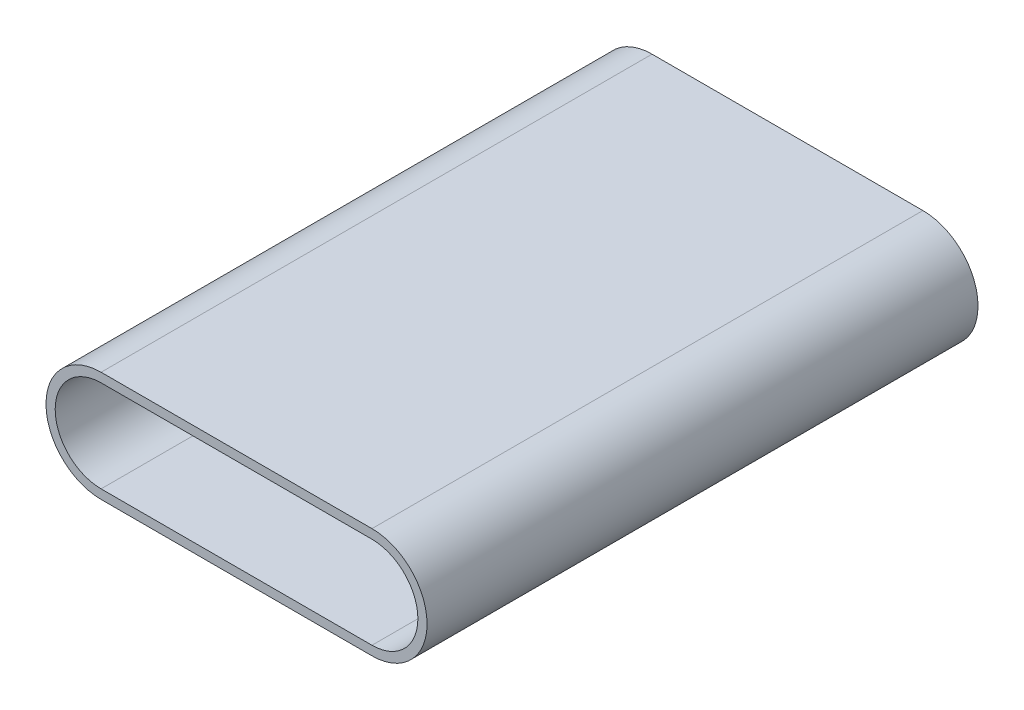
ISO-10303-21;
HEADER;
FILE_DESCRIPTION(('STEP AP214'),'2;1');
FILE_NAME('part.step','',(''),(''),'','','');
FILE_SCHEMA(('AUTOMOTIVE_DESIGN { 1 0 10303 214 1 1 1 1 }'));
ENDSEC;
DATA;
#1=APPLICATION_CONTEXT('core data for automotive mechanical design processes');
#2=APPLICATION_PROTOCOL_DEFINITION('international standard','automotive_design',2000,#1);
#3=PRODUCT_CONTEXT('',#1,'mechanical');
#4=PRODUCT('Part','Part','',(#3));
#5=PRODUCT_RELATED_PRODUCT_CATEGORY('part','',(#4));
#6=PRODUCT_DEFINITION_FORMATION('','',#4);
#7=PRODUCT_DEFINITION_CONTEXT('part definition',#1,'design');
#8=PRODUCT_DEFINITION('design','',#6,#7);
#9=PRODUCT_DEFINITION_SHAPE('','',#8);
#10=(LENGTH_UNIT() NAMED_UNIT(*) SI_UNIT(.MILLI.,.METRE.));
#11=(NAMED_UNIT(*) PLANE_ANGLE_UNIT() SI_UNIT($,.RADIAN.));
#12=(NAMED_UNIT(*) SI_UNIT($,.STERADIAN.) SOLID_ANGLE_UNIT());
#13=UNCERTAINTY_MEASURE_WITH_UNIT(LENGTH_MEASURE(1.E-05),#10,'distance_accuracy_value','');
#14=(GEOMETRIC_REPRESENTATION_CONTEXT(3) GLOBAL_UNCERTAINTY_ASSIGNED_CONTEXT((#13)) GLOBAL_UNIT_ASSIGNED_CONTEXT((#10,
#11,#12)) REPRESENTATION_CONTEXT('',''));
#15=CARTESIAN_POINT('',(0.,0.,0.));
#16=DIRECTION('',(0.,0.,1.));
#17=DIRECTION('',(1.,0.,0.));
#18=AXIS2_PLACEMENT_3D('',#15,#16,#17);
#19=CARTESIAN_POINT('',(-2.95,0.,6.));
#20=DIRECTION('',(0.,0.,1.));
#21=DIRECTION('',(1.,0.,0.));
#22=AXIS2_PLACEMENT_3D('',#19,#20,#21);
#23=PLANE('',#22);
#24=CARTESIAN_POINT('',(-2.95,0.,6.));
#25=DIRECTION('',(0.,0.,1.));
#26=DIRECTION('',(1.,0.,0.));
#27=AXIS2_PLACEMENT_3D('',#24,#25,#26);
#28=CIRCLE('',#27,1.2);
#29=CARTESIAN_POINT('',(-2.95,1.2,6.));
#30=VERTEX_POINT('',#29);
#31=CARTESIAN_POINT('',(-2.95,-1.2,6.));
#32=VERTEX_POINT('',#31);
#33=EDGE_CURVE('E133',#30,#32,#28,.T.);
#34=ORIENTED_EDGE('',*,*,#33,.T.);
#35=DIRECTION('',(1.,0.,0.));
#36=VECTOR('',#35,1.);
#37=CARTESIAN_POINT('',(-2.95,-1.2,6.));
#38=LINE('',#37,#36);
#39=CARTESIAN_POINT('',(2.95,-1.2,6.));
#40=VERTEX_POINT('',#39);
#41=EDGE_CURVE('E136',#32,#40,#38,.T.);
#42=ORIENTED_EDGE('',*,*,#41,.T.);
#43=CARTESIAN_POINT('',(2.95,0.,6.));
#44=DIRECTION('',(0.,0.,1.));
#45=DIRECTION('',(1.,0.,0.));
#46=AXIS2_PLACEMENT_3D('',#43,#44,#45);
#47=CIRCLE('',#46,1.2);
#48=CARTESIAN_POINT('',(2.95,1.2,6.));
#49=VERTEX_POINT('',#48);
#50=EDGE_CURVE('E139',#40,#49,#47,.T.);
#51=ORIENTED_EDGE('',*,*,#50,.T.);
#52=DIRECTION('',(-1.,0.,0.));
#53=VECTOR('',#52,1.);
#54=CARTESIAN_POINT('',(-2.95,1.2,6.));
#55=LINE('',#54,#53);
#56=EDGE_CURVE('E141',#49,#30,#55,.T.);
#57=ORIENTED_EDGE('',*,*,#56,.T.);
#58=EDGE_LOOP('',(#34,#42,#51,#57));
#59=FACE_BOUND('',#58,.T.);
#60=DIRECTION('',(1.,0.,0.));
#61=VECTOR('',#60,1.);
#62=CARTESIAN_POINT('',(-2.95,-1.,6.));
#63=LINE('',#62,#61);
#64=CARTESIAN_POINT('',(-2.95,-1.,6.));
#65=VERTEX_POINT('',#64);
#66=CARTESIAN_POINT('',(2.95,-1.,6.));
#67=VERTEX_POINT('',#66);
#68=EDGE_CURVE('E105',#65,#67,#63,.T.);
#69=ORIENTED_EDGE('',*,*,#68,.F.);
#70=CARTESIAN_POINT('',(-2.95,0.,6.));
#71=DIRECTION('',(0.,0.,1.));
#72=DIRECTION('',(1.,0.,0.));
#73=AXIS2_PLACEMENT_3D('',#70,#71,#72);
#74=CIRCLE('',#73,1.);
#75=CARTESIAN_POINT('',(-2.95,1.,6.));
#76=VERTEX_POINT('',#75);
#77=EDGE_CURVE('E97',#76,#65,#74,.T.);
#78=ORIENTED_EDGE('',*,*,#77,.F.);
#79=DIRECTION('',(-1.,0.,0.));
#80=VECTOR('',#79,1.);
#81=CARTESIAN_POINT('',(-2.95,1.,6.));
#82=LINE('',#81,#80);
#83=CARTESIAN_POINT('',(2.95,1.,6.));
#84=VERTEX_POINT('',#83);
#85=EDGE_CURVE('E119',#84,#76,#82,.T.);
#86=ORIENTED_EDGE('',*,*,#85,.F.);
#87=CARTESIAN_POINT('',(2.95,0.,6.));
#88=DIRECTION('',(0.,0.,1.));
#89=DIRECTION('',(1.,0.,0.));
#90=AXIS2_PLACEMENT_3D('',#87,#88,#89);
#91=CIRCLE('',#90,1.);
#92=EDGE_CURVE('E117',#67,#84,#91,.T.);
#93=ORIENTED_EDGE('',*,*,#92,.F.);
#94=EDGE_LOOP('',(#69,#78,#86,#93));
#95=FACE_BOUND('',#94,.T.);
#96=ADVANCED_FACE('F32',(#59,#95),#23,.T.);
#97=CARTESIAN_POINT('',(-2.95,0.,-6.));
#98=DIRECTION('',(0.,0.,1.));
#99=DIRECTION('',(1.,0.,0.));
#100=AXIS2_PLACEMENT_3D('',#97,#98,#99);
#101=PLANE('',#100);
#102=CARTESIAN_POINT('',(-2.95,0.,-6.));
#103=DIRECTION('',(0.,0.,1.));
#104=DIRECTION('',(1.,0.,0.));
#105=AXIS2_PLACEMENT_3D('',#102,#103,#104);
#106=CIRCLE('',#105,1.2);
#107=CARTESIAN_POINT('',(-2.95,1.2,-6.));
#108=VERTEX_POINT('',#107);
#109=CARTESIAN_POINT('',(-2.95,-1.2,-6.));
#110=VERTEX_POINT('',#109);
#111=EDGE_CURVE('E113',#108,#110,#106,.T.);
#112=ORIENTED_EDGE('',*,*,#111,.F.);
#113=DIRECTION('',(-1.,0.,0.));
#114=VECTOR('',#113,1.);
#115=CARTESIAN_POINT('',(-2.95,1.2,-6.));
#116=LINE('',#115,#114);
#117=CARTESIAN_POINT('',(2.95,1.2,-6.));
#118=VERTEX_POINT('',#117);
#119=EDGE_CURVE('E137',#118,#108,#116,.T.);
#120=ORIENTED_EDGE('',*,*,#119,.F.);
#121=CARTESIAN_POINT('',(2.95,0.,-6.));
#122=DIRECTION('',(0.,0.,1.));
#123=DIRECTION('',(1.,0.,0.));
#124=AXIS2_PLACEMENT_3D('',#121,#122,#123);
#125=CIRCLE('',#124,1.2);
#126=CARTESIAN_POINT('',(2.95,-1.2,-6.));
#127=VERTEX_POINT('',#126);
#128=EDGE_CURVE('E148',#127,#118,#125,.T.);
#129=ORIENTED_EDGE('',*,*,#128,.F.);
#130=DIRECTION('',(1.,0.,0.));
#131=VECTOR('',#130,1.);
#132=CARTESIAN_POINT('',(-2.95,-1.2,-6.));
#133=LINE('',#132,#131);
#134=EDGE_CURVE('E146',#110,#127,#133,.T.);
#135=ORIENTED_EDGE('',*,*,#134,.F.);
#136=EDGE_LOOP('',(#112,#120,#129,#135));
#137=FACE_BOUND('',#136,.T.);
#138=CARTESIAN_POINT('',(-2.95,0.,-6.));
#139=DIRECTION('',(0.,0.,1.));
#140=DIRECTION('',(1.,0.,0.));
#141=AXIS2_PLACEMENT_3D('',#138,#139,#140);
#142=CIRCLE('',#141,1.);
#143=CARTESIAN_POINT('',(-2.95,1.,-6.));
#144=VERTEX_POINT('',#143);
#145=CARTESIAN_POINT('',(-2.95,-1.,-6.));
#146=VERTEX_POINT('',#145);
#147=EDGE_CURVE('E55',#144,#146,#142,.T.);
#148=ORIENTED_EDGE('',*,*,#147,.T.);
#149=DIRECTION('',(1.,0.,0.));
#150=VECTOR('',#149,1.);
#151=CARTESIAN_POINT('',(-2.95,-1.,-6.));
#152=LINE('',#151,#150);
#153=CARTESIAN_POINT('',(2.95,-1.,-6.));
#154=VERTEX_POINT('',#153);
#155=EDGE_CURVE('E112',#146,#154,#152,.T.);
#156=ORIENTED_EDGE('',*,*,#155,.T.);
#157=CARTESIAN_POINT('',(2.95,0.,-6.));
#158=DIRECTION('',(0.,0.,1.));
#159=DIRECTION('',(1.,0.,0.));
#160=AXIS2_PLACEMENT_3D('',#157,#158,#159);
#161=CIRCLE('',#160,1.);
#162=CARTESIAN_POINT('',(2.95,1.,-6.));
#163=VERTEX_POINT('',#162);
#164=EDGE_CURVE('E125',#154,#163,#161,.T.);
#165=ORIENTED_EDGE('',*,*,#164,.T.);
#166=DIRECTION('',(-1.,0.,0.));
#167=VECTOR('',#166,1.);
#168=CARTESIAN_POINT('',(-2.95,1.,-6.));
#169=LINE('',#168,#167);
#170=EDGE_CURVE('E106',#163,#144,#169,.T.);
#171=ORIENTED_EDGE('',*,*,#170,.T.);
#172=EDGE_LOOP('',(#148,#156,#165,#171));
#173=FACE_BOUND('',#172,.T.);
#174=ADVANCED_FACE('F166',(#137,#173),#101,.F.);
#175=CARTESIAN_POINT('',(-2.95,0.,6.));
#176=DIRECTION('',(0.,0.,-1.));
#177=DIRECTION('',(-1.,0.,0.));
#178=AXIS2_PLACEMENT_3D('',#175,#176,#177);
#179=CYLINDRICAL_SURFACE('',#178,1.2);
#180=ORIENTED_EDGE('',*,*,#111,.T.);
#181=DIRECTION('',(0.,0.,-1.));
#182=VECTOR('',#181,1.);
#183=CARTESIAN_POINT('',(-2.95,-1.2,6.));
#184=LINE('',#183,#182);
#185=EDGE_CURVE('E11',#32,#110,#184,.T.);
#186=ORIENTED_EDGE('',*,*,#185,.F.);
#187=ORIENTED_EDGE('',*,*,#33,.F.);
#188=DIRECTION('',(0.,0.,-1.));
#189=VECTOR('',#188,1.);
#190=CARTESIAN_POINT('',(-2.95,1.2,6.));
#191=LINE('',#190,#189);
#192=EDGE_CURVE('E143',#30,#108,#191,.T.);
#193=ORIENTED_EDGE('',*,*,#192,.T.);
#194=EDGE_LOOP('',(#180,#186,#187,#193));
#195=FACE_BOUND('',#194,.T.);
#196=ADVANCED_FACE('F34',(#195),#179,.T.);
#197=CARTESIAN_POINT('',(-2.95,-1.2,6.));
#198=DIRECTION('',(0.,1.,0.));
#199=DIRECTION('',(0.,0.,1.));
#200=AXIS2_PLACEMENT_3D('',#197,#198,#199);
#201=PLANE('',#200);
#202=ORIENTED_EDGE('',*,*,#134,.T.);
#203=DIRECTION('',(0.,0.,-1.));
#204=VECTOR('',#203,1.);
#205=CARTESIAN_POINT('',(2.95,-1.2,6.));
#206=LINE('',#205,#204);
#207=EDGE_CURVE('E40',#40,#127,#206,.T.);
#208=ORIENTED_EDGE('',*,*,#207,.F.);
#209=ORIENTED_EDGE('',*,*,#41,.F.);
#210=ORIENTED_EDGE('',*,*,#185,.T.);
#211=EDGE_LOOP('',(#202,#208,#209,#210));
#212=FACE_BOUND('',#211,.T.);
#213=ADVANCED_FACE('F176',(#212),#201,.F.);
#214=CARTESIAN_POINT('',(2.95,0.,6.));
#215=DIRECTION('',(0.,0.,-1.));
#216=DIRECTION('',(-1.,0.,0.));
#217=AXIS2_PLACEMENT_3D('',#214,#215,#216);
#218=CYLINDRICAL_SURFACE('',#217,1.2);
#219=ORIENTED_EDGE('',*,*,#128,.T.);
#220=DIRECTION('',(0.,0.,-1.));
#221=VECTOR('',#220,1.);
#222=CARTESIAN_POINT('',(2.95,1.2,6.));
#223=LINE('',#222,#221);
#224=EDGE_CURVE('E153',#49,#118,#223,.T.);
#225=ORIENTED_EDGE('',*,*,#224,.F.);
#226=ORIENTED_EDGE('',*,*,#50,.F.);
#227=ORIENTED_EDGE('',*,*,#207,.T.);
#228=EDGE_LOOP('',(#219,#225,#226,#227));
#229=FACE_BOUND('',#228,.T.);
#230=ADVANCED_FACE('F160',(#229),#218,.T.);
#231=CARTESIAN_POINT('',(-2.95,1.2,6.));
#232=DIRECTION('',(0.,-1.,0.));
#233=DIRECTION('',(0.,0.,-1.));
#234=AXIS2_PLACEMENT_3D('',#231,#232,#233);
#235=PLANE('',#234);
#236=ORIENTED_EDGE('',*,*,#119,.T.);
#237=ORIENTED_EDGE('',*,*,#192,.F.);
#238=ORIENTED_EDGE('',*,*,#56,.F.);
#239=ORIENTED_EDGE('',*,*,#224,.T.);
#240=EDGE_LOOP('',(#236,#237,#238,#239));
#241=FACE_BOUND('',#240,.T.);
#242=ADVANCED_FACE('F170',(#241),#235,.F.);
#243=CARTESIAN_POINT('',(-2.95,0.,6.));
#244=DIRECTION('',(0.,0.,-1.));
#245=DIRECTION('',(-1.,0.,0.));
#246=AXIS2_PLACEMENT_3D('',#243,#244,#245);
#247=CYLINDRICAL_SURFACE('',#246,1.);
#248=ORIENTED_EDGE('',*,*,#147,.F.);
#249=DIRECTION('',(0.,0.,-1.));
#250=VECTOR('',#249,1.);
#251=CARTESIAN_POINT('',(-2.95,1.,6.));
#252=LINE('',#251,#250);
#253=EDGE_CURVE('E101',#76,#144,#252,.T.);
#254=ORIENTED_EDGE('',*,*,#253,.F.);
#255=ORIENTED_EDGE('',*,*,#77,.T.);
#256=DIRECTION('',(0.,0.,-1.));
#257=VECTOR('',#256,1.);
#258=CARTESIAN_POINT('',(-2.95,-1.,6.));
#259=LINE('',#258,#257);
#260=EDGE_CURVE('E100',#65,#146,#259,.T.);
#261=ORIENTED_EDGE('',*,*,#260,.T.);
#262=EDGE_LOOP('',(#248,#254,#255,#261));
#263=FACE_BOUND('',#262,.T.);
#264=ADVANCED_FACE('F99',(#263),#247,.F.);
#265=CARTESIAN_POINT('',(-2.95,-1.,6.));
#266=DIRECTION('',(0.,1.,0.));
#267=DIRECTION('',(-1.,0.,0.));
#268=AXIS2_PLACEMENT_3D('',#265,#266,#267);
#269=PLANE('',#268);
#270=ORIENTED_EDGE('',*,*,#155,.F.);
#271=ORIENTED_EDGE('',*,*,#260,.F.);
#272=ORIENTED_EDGE('',*,*,#68,.T.);
#273=DIRECTION('',(0.,0.,-1.));
#274=VECTOR('',#273,1.);
#275=CARTESIAN_POINT('',(2.95,-1.,6.));
#276=LINE('',#275,#274);
#277=EDGE_CURVE('E114',#67,#154,#276,.T.);
#278=ORIENTED_EDGE('',*,*,#277,.T.);
#279=EDGE_LOOP('',(#270,#271,#272,#278));
#280=FACE_BOUND('',#279,.T.);
#281=ADVANCED_FACE('F109',(#280),#269,.T.);
#282=CARTESIAN_POINT('',(2.95,0.,6.));
#283=DIRECTION('',(0.,0.,-1.));
#284=DIRECTION('',(-1.,0.,0.));
#285=AXIS2_PLACEMENT_3D('',#282,#283,#284);
#286=CYLINDRICAL_SURFACE('',#285,1.);
#287=ORIENTED_EDGE('',*,*,#164,.F.);
#288=ORIENTED_EDGE('',*,*,#277,.F.);
#289=ORIENTED_EDGE('',*,*,#92,.T.);
#290=DIRECTION('',(0.,0.,-1.));
#291=VECTOR('',#290,1.);
#292=CARTESIAN_POINT('',(2.95,1.,6.));
#293=LINE('',#292,#291);
#294=EDGE_CURVE('E47',#84,#163,#293,.T.);
#295=ORIENTED_EDGE('',*,*,#294,.T.);
#296=EDGE_LOOP('',(#287,#288,#289,#295));
#297=FACE_BOUND('',#296,.T.);
#298=ADVANCED_FACE('F199',(#297),#286,.F.);
#299=CARTESIAN_POINT('',(-2.95,1.,6.));
#300=DIRECTION('',(0.,-1.,0.));
#301=DIRECTION('',(0.,0.,-1.));
#302=AXIS2_PLACEMENT_3D('',#299,#300,#301);
#303=PLANE('',#302);
#304=ORIENTED_EDGE('',*,*,#170,.F.);
#305=ORIENTED_EDGE('',*,*,#294,.F.);
#306=ORIENTED_EDGE('',*,*,#85,.T.);
#307=ORIENTED_EDGE('',*,*,#253,.T.);
#308=EDGE_LOOP('',(#304,#305,#306,#307));
#309=FACE_BOUND('',#308,.T.);
#310=ADVANCED_FACE('F203',(#309),#303,.T.);
#311=CLOSED_SHELL('',(#96,#174,#196,#213,#230,#242,#264,#281,#298,#310));
#312=MANIFOLD_SOLID_BREP('B2',#311);
#313=ADVANCED_BREP_SHAPE_REPRESENTATION('',(#18,#312),#14);
#314=SHAPE_DEFINITION_REPRESENTATION(#9,#313);
ENDSEC;
END-ISO-10303-21;
